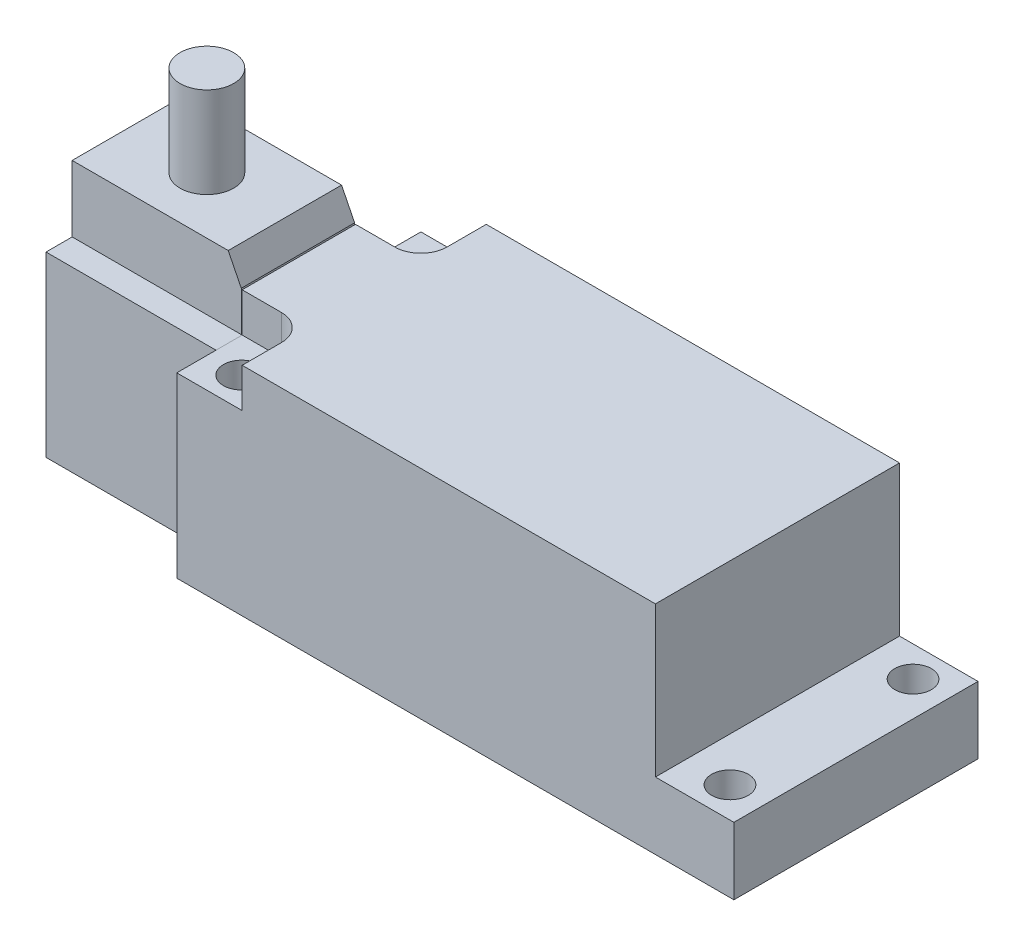
ISO-10303-21;
HEADER;
FILE_DESCRIPTION(('STEP AP214'),'2;1');
FILE_NAME('part.step','',(''),(''),'','','');
FILE_SCHEMA(('AUTOMOTIVE_DESIGN { 1 0 10303 214 1 1 1 1 }'));
ENDSEC;
DATA;
#1=APPLICATION_CONTEXT('core data for automotive mechanical design processes');
#2=APPLICATION_PROTOCOL_DEFINITION('international standard','automotive_design',2000,#1);
#3=PRODUCT_CONTEXT('',#1,'mechanical');
#4=PRODUCT('Part','Part','',(#3));
#5=PRODUCT_RELATED_PRODUCT_CATEGORY('part','',(#4));
#6=PRODUCT_DEFINITION_FORMATION('','',#4);
#7=PRODUCT_DEFINITION_CONTEXT('part definition',#1,'design');
#8=PRODUCT_DEFINITION('design','',#6,#7);
#9=PRODUCT_DEFINITION_SHAPE('','',#8);
#10=(LENGTH_UNIT() NAMED_UNIT(*) SI_UNIT(.MILLI.,.METRE.));
#11=(NAMED_UNIT(*) PLANE_ANGLE_UNIT() SI_UNIT($,.RADIAN.));
#12=(NAMED_UNIT(*) SI_UNIT($,.STERADIAN.) SOLID_ANGLE_UNIT());
#13=UNCERTAINTY_MEASURE_WITH_UNIT(LENGTH_MEASURE(1.E-05),#10,'distance_accuracy_value','');
#14=(GEOMETRIC_REPRESENTATION_CONTEXT(3) GLOBAL_UNCERTAINTY_ASSIGNED_CONTEXT((#13)) GLOBAL_UNIT_ASSIGNED_CONTEXT((#10,
#11,#12)) REPRESENTATION_CONTEXT('',''));
#15=CARTESIAN_POINT('',(0.,0.,0.));
#16=DIRECTION('',(0.,0.,1.));
#17=DIRECTION('',(1.,0.,0.));
#18=AXIS2_PLACEMENT_3D('',#15,#16,#17);
#19=CARTESIAN_POINT('',(0.,28.,0.));
#20=DIRECTION('',(0.,1.,0.));
#21=DIRECTION('',(0.,0.,1.));
#22=AXIS2_PLACEMENT_3D('',#19,#20,#21);
#23=PLANE('',#22);
#24=DIRECTION('',(-1.,0.,0.));
#25=VECTOR('',#24,1.);
#26=CARTESIAN_POINT('',(0.,28.,6.5));
#27=LINE('',#26,#25);
#28=CARTESIAN_POINT('',(-1.6,28.,6.5));
#29=VERTEX_POINT('',#28);
#30=CARTESIAN_POINT('',(-19.5,28.,6.5));
#31=VERTEX_POINT('',#30);
#32=EDGE_CURVE('E145',#29,#31,#27,.T.);
#33=ORIENTED_EDGE('',*,*,#32,.F.);
#34=DIRECTION('',(0.,0.,-1.));
#35=VECTOR('',#34,1.);
#36=CARTESIAN_POINT('',(-1.6,28.,0.));
#37=LINE('',#36,#35);
#38=CARTESIAN_POINT('',(-1.6,28.,-6.50000000000001));
#39=VERTEX_POINT('',#38);
#40=EDGE_CURVE('E63',#29,#39,#37,.T.);
#41=ORIENTED_EDGE('',*,*,#40,.T.);
#42=DIRECTION('',(1.,0.,0.));
#43=VECTOR('',#42,1.);
#44=CARTESIAN_POINT('',(0.,28.,-6.50000000000001));
#45=LINE('',#44,#43);
#46=CARTESIAN_POINT('',(-19.5,28.,-6.50000000000001));
#47=VERTEX_POINT('',#46);
#48=EDGE_CURVE('E126',#47,#39,#45,.T.);
#49=ORIENTED_EDGE('',*,*,#48,.F.);
#50=DIRECTION('',(0.,0.,-1.));
#51=VECTOR('',#50,1.);
#52=CARTESIAN_POINT('',(-19.5,28.,0.));
#53=LINE('',#52,#51);
#54=EDGE_CURVE('E138',#31,#47,#53,.T.);
#55=ORIENTED_EDGE('',*,*,#54,.F.);
#56=EDGE_LOOP('',(#33,#41,#49,#55));
#57=FACE_BOUND('',#56,.T.);
#58=CARTESIAN_POINT('',(-10.55,28.,0.));
#59=DIRECTION('',(0.,1.,0.));
#60=DIRECTION('',(0.,0.,1.));
#61=AXIS2_PLACEMENT_3D('',#58,#59,#60);
#62=CIRCLE('',#61,3.075);
#63=CARTESIAN_POINT('',(-10.55,28.,3.075));
#64=VERTEX_POINT('',#63);
#65=EDGE_CURVE('E366',#64,#64,#62,.T.);
#66=ORIENTED_EDGE('',*,*,#65,.F.);
#67=EDGE_LOOP('',(#66));
#68=FACE_BOUND('',#67,.T.);
#69=ADVANCED_FACE('F55',(#57,#68),#23,.T.);
#70=CARTESIAN_POINT('',(0.,20.4,9.5));
#71=DIRECTION('',(1.,0.,0.));
#72=DIRECTION('',(0.,0.,-1.));
#73=AXIS2_PLACEMENT_3D('',#70,#71,#72);
#74=PLANE('',#73);
#75=DIRECTION('',(0.,0.,1.));
#76=VECTOR('',#75,1.);
#77=CARTESIAN_POINT('',(0.,0.,9.5));
#78=LINE('',#77,#76);
#79=CARTESIAN_POINT('',(0.,0.,-9.5));
#80=VERTEX_POINT('',#79);
#81=CARTESIAN_POINT('',(0.,0.,9.5));
#82=VERTEX_POINT('',#81);
#83=EDGE_CURVE('E198',#80,#82,#78,.T.);
#84=ORIENTED_EDGE('',*,*,#83,.F.);
#85=DIRECTION('',(0.,-1.,0.));
#86=VECTOR('',#85,1.);
#87=CARTESIAN_POINT('',(0.,20.4,-9.5));
#88=LINE('',#87,#86);
#89=CARTESIAN_POINT('',(0.,20.4,-9.5));
#90=VERTEX_POINT('',#89);
#91=EDGE_CURVE('E167',#90,#80,#88,.T.);
#92=ORIENTED_EDGE('',*,*,#91,.F.);
#93=DIRECTION('',(0.,0.,1.));
#94=VECTOR('',#93,1.);
#95=CARTESIAN_POINT('',(0.,20.4,9.5));
#96=LINE('',#95,#94);
#97=CARTESIAN_POINT('',(0.,20.4,9.5));
#98=VERTEX_POINT('',#97);
#99=EDGE_CURVE('E207',#90,#98,#96,.T.);
#100=ORIENTED_EDGE('',*,*,#99,.T.);
#101=DIRECTION('',(0.,-1.,0.));
#102=VECTOR('',#101,1.);
#103=CARTESIAN_POINT('',(0.,20.4,9.5));
#104=LINE('',#103,#102);
#105=EDGE_CURVE('E184',#98,#82,#104,.T.);
#106=ORIENTED_EDGE('',*,*,#105,.T.);
#107=EDGE_LOOP('',(#84,#92,#100,#106));
#108=FACE_BOUND('',#107,.T.);
#109=ADVANCED_FACE('F232',(#108),#74,.T.);
#110=CARTESIAN_POINT('',(-19.5,20.4,-9.5));
#111=DIRECTION('',(0.,0.,-1.));
#112=DIRECTION('',(-1.,0.,0.));
#113=AXIS2_PLACEMENT_3D('',#110,#111,#112);
#114=PLANE('',#113);
#115=DIRECTION('',(1.,0.,0.));
#116=VECTOR('',#115,1.);
#117=CARTESIAN_POINT('',(-19.5,0.,-9.5));
#118=LINE('',#117,#116);
#119=CARTESIAN_POINT('',(-19.5,0.,-9.5));
#120=VERTEX_POINT('',#119);
#121=EDGE_CURVE('E180',#120,#80,#118,.T.);
#122=ORIENTED_EDGE('',*,*,#121,.F.);
#123=DIRECTION('',(0.,-1.,0.));
#124=VECTOR('',#123,1.);
#125=CARTESIAN_POINT('',(-19.5,20.4,-9.5));
#126=LINE('',#125,#124);
#127=CARTESIAN_POINT('',(-19.5,20.4,-9.5));
#128=VERTEX_POINT('',#127);
#129=EDGE_CURVE('E171',#128,#120,#126,.T.);
#130=ORIENTED_EDGE('',*,*,#129,.F.);
#131=DIRECTION('',(1.,0.,0.));
#132=VECTOR('',#131,1.);
#133=CARTESIAN_POINT('',(-19.5,20.4,-9.5));
#134=LINE('',#133,#132);
#135=EDGE_CURVE('E186',#128,#90,#134,.T.);
#136=ORIENTED_EDGE('',*,*,#135,.T.);
#137=ORIENTED_EDGE('',*,*,#91,.T.);
#138=EDGE_LOOP('',(#122,#130,#136,#137));
#139=FACE_BOUND('',#138,.T.);
#140=ADVANCED_FACE('F230',(#139),#114,.T.);
#141=CARTESIAN_POINT('',(-19.5,20.4,9.5));
#142=DIRECTION('',(-1.,0.,0.));
#143=DIRECTION('',(0.,0.,1.));
#144=AXIS2_PLACEMENT_3D('',#141,#142,#143);
#145=PLANE('',#144);
#146=DIRECTION('',(0.,0.,-1.));
#147=VECTOR('',#146,1.);
#148=CARTESIAN_POINT('',(-19.5,0.,9.5));
#149=LINE('',#148,#147);
#150=CARTESIAN_POINT('',(-19.5,0.,9.5));
#151=VERTEX_POINT('',#150);
#152=EDGE_CURVE('E203',#151,#120,#149,.T.);
#153=ORIENTED_EDGE('',*,*,#152,.F.);
#154=DIRECTION('',(0.,-1.,0.));
#155=VECTOR('',#154,1.);
#156=CARTESIAN_POINT('',(-19.5,20.4,9.5));
#157=LINE('',#156,#155);
#158=CARTESIAN_POINT('',(-19.5,20.4,9.5));
#159=VERTEX_POINT('',#158);
#160=EDGE_CURVE('E177',#159,#151,#157,.T.);
#161=ORIENTED_EDGE('',*,*,#160,.F.);
#162=DIRECTION('',(0.,0.,-1.));
#163=VECTOR('',#162,1.);
#164=CARTESIAN_POINT('',(-19.5,20.4,9.5));
#165=LINE('',#164,#163);
#166=CARTESIAN_POINT('',(-19.5,20.4,6.5));
#167=VERTEX_POINT('',#166);
#168=EDGE_CURVE('E187',#159,#167,#165,.T.);
#169=ORIENTED_EDGE('',*,*,#168,.T.);
#170=DIRECTION('',(0.,-1.,0.));
#171=VECTOR('',#170,1.);
#172=CARTESIAN_POINT('',(-19.5,28.,6.5));
#173=LINE('',#172,#171);
#174=EDGE_CURVE('E134',#31,#167,#173,.T.);
#175=ORIENTED_EDGE('',*,*,#174,.F.);
#176=ORIENTED_EDGE('',*,*,#54,.T.);
#177=DIRECTION('',(0.,-1.,0.));
#178=VECTOR('',#177,1.);
#179=CARTESIAN_POINT('',(-19.5,28.,-6.50000000000001));
#180=LINE('',#179,#178);
#181=CARTESIAN_POINT('',(-19.5,20.4,-6.50000000000001));
#182=VERTEX_POINT('',#181);
#183=EDGE_CURVE('E124',#47,#182,#180,.T.);
#184=ORIENTED_EDGE('',*,*,#183,.T.);
#185=EDGE_CURVE('E190',#182,#128,#165,.T.);
#186=ORIENTED_EDGE('',*,*,#185,.T.);
#187=ORIENTED_EDGE('',*,*,#129,.T.);
#188=EDGE_LOOP('',(#153,#161,#169,#175,#176,#184,#186,#187));
#189=FACE_BOUND('',#188,.T.);
#190=ADVANCED_FACE('F143',(#189),#145,.T.);
#191=CARTESIAN_POINT('',(-19.5,20.4,9.5));
#192=DIRECTION('',(0.,0.,1.));
#193=DIRECTION('',(1.,0.,0.));
#194=AXIS2_PLACEMENT_3D('',#191,#192,#193);
#195=PLANE('',#194);
#196=DIRECTION('',(-1.,0.,0.));
#197=VECTOR('',#196,1.);
#198=CARTESIAN_POINT('',(-19.5,0.,9.5));
#199=LINE('',#198,#197);
#200=EDGE_CURVE('E201',#82,#151,#199,.T.);
#201=ORIENTED_EDGE('',*,*,#200,.F.);
#202=ORIENTED_EDGE('',*,*,#105,.F.);
#203=DIRECTION('',(-1.,0.,0.));
#204=VECTOR('',#203,1.);
#205=CARTESIAN_POINT('',(-19.5,20.4,9.5));
#206=LINE('',#205,#204);
#207=EDGE_CURVE('E194',#98,#159,#206,.T.);
#208=ORIENTED_EDGE('',*,*,#207,.T.);
#209=ORIENTED_EDGE('',*,*,#160,.T.);
#210=EDGE_LOOP('',(#201,#202,#208,#209));
#211=FACE_BOUND('',#210,.T.);
#212=ADVANCED_FACE('F228',(#211),#195,.T.);
#213=CARTESIAN_POINT('',(0.,20.4,-9.5));
#214=DIRECTION('',(0.,-1.,0.));
#215=DIRECTION('',(0.,0.,-1.));
#216=AXIS2_PLACEMENT_3D('',#213,#214,#215);
#217=PLANE('',#216);
#218=DIRECTION('',(0.,0.,1.));
#219=VECTOR('',#218,1.);
#220=CARTESIAN_POINT('',(-0.100000000000001,20.4,0.));
#221=LINE('',#220,#219);
#222=CARTESIAN_POINT('',(-0.100000000000001,20.4,-6.50000000000001));
#223=VERTEX_POINT('',#222);
#224=CARTESIAN_POINT('',(-0.100000000000001,20.4,6.5));
#225=VERTEX_POINT('',#224);
#226=EDGE_CURVE('E151',#223,#225,#221,.T.);
#227=ORIENTED_EDGE('',*,*,#226,.T.);
#228=DIRECTION('',(-1.,0.,0.));
#229=VECTOR('',#228,1.);
#230=CARTESIAN_POINT('',(0.,20.4,6.5));
#231=LINE('',#230,#229);
#232=EDGE_CURVE('E139',#225,#167,#231,.T.);
#233=ORIENTED_EDGE('',*,*,#232,.T.);
#234=ORIENTED_EDGE('',*,*,#168,.F.);
#235=ORIENTED_EDGE('',*,*,#207,.F.);
#236=ORIENTED_EDGE('',*,*,#99,.F.);
#237=ORIENTED_EDGE('',*,*,#135,.F.);
#238=ORIENTED_EDGE('',*,*,#185,.F.);
#239=DIRECTION('',(1.,0.,0.));
#240=VECTOR('',#239,1.);
#241=CARTESIAN_POINT('',(0.,20.4,-6.50000000000001));
#242=LINE('',#241,#240);
#243=EDGE_CURVE('E129',#182,#223,#242,.T.);
#244=ORIENTED_EDGE('',*,*,#243,.T.);
#245=EDGE_LOOP('',(#227,#233,#234,#235,#236,#237,#238,#244));
#246=FACE_BOUND('',#245,.T.);
#247=ADVANCED_FACE('F216',(#246),#217,.F.);
#248=CARTESIAN_POINT('',(0.,0.,-9.5));
#249=DIRECTION('',(0.,-1.,0.));
#250=DIRECTION('',(0.,0.,-1.));
#251=AXIS2_PLACEMENT_3D('',#248,#249,#250);
#252=PLANE('',#251);
#253=ORIENTED_EDGE('',*,*,#83,.T.);
#254=ORIENTED_EDGE('',*,*,#200,.T.);
#255=ORIENTED_EDGE('',*,*,#152,.T.);
#256=ORIENTED_EDGE('',*,*,#121,.T.);
#257=EDGE_LOOP('',(#253,#254,#255,#256));
#258=FACE_BOUND('',#257,.T.);
#259=ADVANCED_FACE('F254',(#258),#252,.T.);
#260=CARTESIAN_POINT('',(-0.100000000000001,28.,0.));
#261=DIRECTION('',(1.,0.,0.));
#262=DIRECTION('',(0.,0.,-1.));
#263=AXIS2_PLACEMENT_3D('',#260,#261,#262);
#264=PLANE('',#263);
#265=DIRECTION('',(0.,-1.,0.));
#266=VECTOR('',#265,1.);
#267=CARTESIAN_POINT('',(-0.100000000000001,28.,-6.50000000000001));
#268=LINE('',#267,#266);
#269=CARTESIAN_POINT('',(-0.100000000000001,25.,-6.50000000000001));
#270=VERTEX_POINT('',#269);
#271=EDGE_CURVE('E133',#270,#223,#268,.T.);
#272=ORIENTED_EDGE('',*,*,#271,.F.);
#273=DIRECTION('',(0.,0.,1.));
#274=VECTOR('',#273,1.);
#275=CARTESIAN_POINT('',(-0.100000000000001,25.,0.));
#276=LINE('',#275,#274);
#277=CARTESIAN_POINT('',(-0.100000000000001,25.,6.5));
#278=VERTEX_POINT('',#277);
#279=EDGE_CURVE('E164',#270,#278,#276,.T.);
#280=ORIENTED_EDGE('',*,*,#279,.T.);
#281=DIRECTION('',(0.,-1.,0.));
#282=VECTOR('',#281,1.);
#283=CARTESIAN_POINT('',(-0.100000000000001,28.,6.5));
#284=LINE('',#283,#282);
#285=EDGE_CURVE('E147',#278,#225,#284,.T.);
#286=ORIENTED_EDGE('',*,*,#285,.T.);
#287=ORIENTED_EDGE('',*,*,#226,.F.);
#288=EDGE_LOOP('',(#272,#280,#286,#287));
#289=FACE_BOUND('',#288,.T.);
#290=ADVANCED_FACE('F213',(#289),#264,.T.);
#291=CARTESIAN_POINT('',(0.,28.,-6.50000000000001));
#292=DIRECTION('',(0.,0.,-1.));
#293=DIRECTION('',(-1.,0.,0.));
#294=AXIS2_PLACEMENT_3D('',#291,#292,#293);
#295=PLANE('',#294);
#296=ORIENTED_EDGE('',*,*,#48,.T.);
#297=DIRECTION('',(-0.447213595499956,0.894427190999917,0.));
#298=VECTOR('',#297,1.);
#299=CARTESIAN_POINT('',(-1.28000000000001,27.36,-6.50000000000001));
#300=LINE('',#299,#298);
#301=EDGE_CURVE('E12',#39,#270,#300,.F.);
#302=ORIENTED_EDGE('',*,*,#301,.T.);
#303=ORIENTED_EDGE('',*,*,#271,.T.);
#304=ORIENTED_EDGE('',*,*,#243,.F.);
#305=ORIENTED_EDGE('',*,*,#183,.F.);
#306=EDGE_LOOP('',(#296,#302,#303,#304,#305));
#307=FACE_BOUND('',#306,.T.);
#308=ADVANCED_FACE('F125',(#307),#295,.T.);
#309=CARTESIAN_POINT('',(0.,28.,6.5));
#310=DIRECTION('',(0.,0.,1.));
#311=DIRECTION('',(1.,0.,0.));
#312=AXIS2_PLACEMENT_3D('',#309,#310,#311);
#313=PLANE('',#312);
#314=ORIENTED_EDGE('',*,*,#285,.F.);
#315=DIRECTION('',(0.447213595499956,-0.894427190999917,0.));
#316=VECTOR('',#315,1.);
#317=CARTESIAN_POINT('',(-1.28000000000001,27.36,6.5));
#318=LINE('',#317,#316);
#319=EDGE_CURVE('E77',#278,#29,#318,.F.);
#320=ORIENTED_EDGE('',*,*,#319,.T.);
#321=ORIENTED_EDGE('',*,*,#32,.T.);
#322=ORIENTED_EDGE('',*,*,#174,.T.);
#323=ORIENTED_EDGE('',*,*,#232,.F.);
#324=EDGE_LOOP('',(#314,#320,#321,#322,#323));
#325=FACE_BOUND('',#324,.T.);
#326=ADVANCED_FACE('F223',(#325),#313,.T.);
#327=CARTESIAN_POINT('',(-0.100000000000001,25.,0.));
#328=DIRECTION('',(-0.894427190999917,-0.447213595499956,0.));
#329=DIRECTION('',(0.447213595499956,-0.894427190999917,0.));
#330=AXIS2_PLACEMENT_3D('',#327,#328,#329);
#331=PLANE('',#330);
#332=ORIENTED_EDGE('',*,*,#301,.F.);
#333=ORIENTED_EDGE('',*,*,#40,.F.);
#334=ORIENTED_EDGE('',*,*,#319,.F.);
#335=ORIENTED_EDGE('',*,*,#279,.F.);
#336=EDGE_LOOP('',(#332,#333,#334,#335));
#337=FACE_BOUND('',#336,.T.);
#338=ADVANCED_FACE('F57',(#337),#331,.F.);
#339=CARTESIAN_POINT('',(-10.55,38.4,0.));
#340=DIRECTION('',(0.,-1.,0.));
#341=DIRECTION('',(0.,0.,-1.));
#342=AXIS2_PLACEMENT_3D('',#339,#340,#341);
#343=CYLINDRICAL_SURFACE('',#342,3.075);
#344=CARTESIAN_POINT('',(-10.55,38.4,0.));
#345=DIRECTION('',(0.,1.,0.));
#346=DIRECTION('',(0.,0.,1.));
#347=AXIS2_PLACEMENT_3D('',#344,#345,#346);
#348=CIRCLE('',#347,3.075);
#349=CARTESIAN_POINT('',(-10.55,38.4,3.075));
#350=VERTEX_POINT('',#349);
#351=EDGE_CURVE('E154',#350,#350,#348,.T.);
#352=ORIENTED_EDGE('',*,*,#351,.F.);
#353=EDGE_LOOP('',(#352));
#354=FACE_BOUND('',#353,.T.);
#355=ORIENTED_EDGE('',*,*,#65,.T.);
#356=EDGE_LOOP('',(#355));
#357=FACE_BOUND('',#356,.T.);
#358=ADVANCED_FACE('F246',(#354,#357),#343,.T.);
#359=CARTESIAN_POINT('',(-10.55,38.4,0.));
#360=DIRECTION('',(0.,1.,0.));
#361=DIRECTION('',(0.,0.,1.));
#362=AXIS2_PLACEMENT_3D('',#359,#360,#361);
#363=PLANE('',#362);
#364=ORIENTED_EDGE('',*,*,#351,.T.);
#365=EDGE_LOOP('',(#364));
#366=FACE_BOUND('',#365,.T.);
#367=ADVANCED_FACE('F356',(#366),#363,.T.);
#368=CLOSED_SHELL('',(#69,#109,#140,#190,#212,#247,#259,#290,#308,#326,#338,#358,#367));
#369=MANIFOLD_SOLID_BREP('B2',#368);
#370=CARTESIAN_POINT('',(63.9,24.9,14.));
#371=DIRECTION('',(-1.,0.,0.));
#372=DIRECTION('',(0.,0.,1.));
#373=AXIS2_PLACEMENT_3D('',#370,#371,#372);
#374=PLANE('',#373);
#375=DIRECTION('',(0.,-1.,0.));
#376=VECTOR('',#375,1.);
#377=CARTESIAN_POINT('',(63.9,24.9,-14.));
#378=LINE('',#377,#376);
#379=CARTESIAN_POINT('',(63.9,7.7,-14.));
#380=VERTEX_POINT('',#379);
#381=CARTESIAN_POINT('',(63.9,0.,-14.));
#382=VERTEX_POINT('',#381);
#383=EDGE_CURVE('E53',#380,#382,#378,.T.);
#384=ORIENTED_EDGE('',*,*,#383,.F.);
#385=DIRECTION('',(0.,0.,1.));
#386=VECTOR('',#385,1.);
#387=CARTESIAN_POINT('',(63.9,7.7,-14.));
#388=LINE('',#387,#386);
#389=CARTESIAN_POINT('',(63.9,7.7,14.));
#390=VERTEX_POINT('',#389);
#391=EDGE_CURVE('E566',#380,#390,#388,.T.);
#392=ORIENTED_EDGE('',*,*,#391,.T.);
#393=DIRECTION('',(0.,-1.,0.));
#394=VECTOR('',#393,1.);
#395=CARTESIAN_POINT('',(63.9,24.9,14.));
#396=LINE('',#395,#394);
#397=CARTESIAN_POINT('',(63.9,0.,14.));
#398=VERTEX_POINT('',#397);
#399=EDGE_CURVE('E582',#390,#398,#396,.T.);
#400=ORIENTED_EDGE('',*,*,#399,.T.);
#401=DIRECTION('',(0.,0.,-1.));
#402=VECTOR('',#401,1.);
#403=CARTESIAN_POINT('',(63.9,0.,14.));
#404=LINE('',#403,#402);
#405=EDGE_CURVE('E569',#398,#382,#404,.T.);
#406=ORIENTED_EDGE('',*,*,#405,.T.);
#407=EDGE_LOOP('',(#384,#392,#400,#406));
#408=FACE_BOUND('',#407,.T.);
#409=ADVANCED_FACE('F384',(#408),#374,.F.);
#410=CARTESIAN_POINT('',(0.,24.9,-14.));
#411=DIRECTION('',(0.,0.,1.));
#412=DIRECTION('',(1.,0.,0.));
#413=AXIS2_PLACEMENT_3D('',#410,#411,#412);
#414=PLANE('',#413);
#415=DIRECTION('',(-1.,0.,0.));
#416=VECTOR('',#415,1.);
#417=CARTESIAN_POINT('',(0.,20.4,-14.));
#418=LINE('',#417,#416);
#419=CARTESIAN_POINT('',(7.5,20.4,-14.));
#420=VERTEX_POINT('',#419);
#421=CARTESIAN_POINT('',(0.,20.4,-14.));
#422=VERTEX_POINT('',#421);
#423=EDGE_CURVE('E500',#420,#422,#418,.T.);
#424=ORIENTED_EDGE('',*,*,#423,.F.);
#425=DIRECTION('',(0.,1.,0.));
#426=VECTOR('',#425,1.);
#427=CARTESIAN_POINT('',(7.5,20.4,-14.));
#428=LINE('',#427,#426);
#429=CARTESIAN_POINT('',(7.5,24.9,-14.));
#430=VERTEX_POINT('',#429);
#431=EDGE_CURVE('E491',#420,#430,#428,.T.);
#432=ORIENTED_EDGE('',*,*,#431,.T.);
#433=DIRECTION('',(-1.,0.,0.));
#434=VECTOR('',#433,1.);
#435=CARTESIAN_POINT('',(0.,24.9,-14.));
#436=LINE('',#435,#434);
#437=CARTESIAN_POINT('',(54.9,24.9,-14.));
#438=VERTEX_POINT('',#437);
#439=EDGE_CURVE('E574',#438,#430,#436,.T.);
#440=ORIENTED_EDGE('',*,*,#439,.F.);
#441=DIRECTION('',(0.,-1.,0.));
#442=VECTOR('',#441,1.);
#443=CARTESIAN_POINT('',(54.9,24.9,-14.));
#444=LINE('',#443,#442);
#445=CARTESIAN_POINT('',(54.9,7.7,-14.));
#446=VERTEX_POINT('',#445);
#447=EDGE_CURVE('E555',#438,#446,#444,.T.);
#448=ORIENTED_EDGE('',*,*,#447,.T.);
#449=DIRECTION('',(1.,0.,0.));
#450=VECTOR('',#449,1.);
#451=CARTESIAN_POINT('',(63.9,7.7,-14.));
#452=LINE('',#451,#450);
#453=EDGE_CURVE('E558',#446,#380,#452,.T.);
#454=ORIENTED_EDGE('',*,*,#453,.T.);
#455=ORIENTED_EDGE('',*,*,#383,.T.);
#456=DIRECTION('',(-1.,0.,0.));
#457=VECTOR('',#456,1.);
#458=CARTESIAN_POINT('',(0.,0.,-14.));
#459=LINE('',#458,#457);
#460=CARTESIAN_POINT('',(0.,0.,-14.));
#461=VERTEX_POINT('',#460);
#462=EDGE_CURVE('E585',#382,#461,#459,.T.);
#463=ORIENTED_EDGE('',*,*,#462,.T.);
#464=DIRECTION('',(0.,-1.,0.));
#465=VECTOR('',#464,1.);
#466=CARTESIAN_POINT('',(0.,24.9,-14.));
#467=LINE('',#466,#465);
#468=EDGE_CURVE('E392',#422,#461,#467,.T.);
#469=ORIENTED_EDGE('',*,*,#468,.F.);
#470=EDGE_LOOP('',(#424,#432,#440,#448,#454,#455,#463,#469));
#471=FACE_BOUND('',#470,.T.);
#472=ADVANCED_FACE('F607',(#471),#414,.F.);
#473=CARTESIAN_POINT('',(0.,24.9,14.));
#474=DIRECTION('',(1.,0.,0.));
#475=DIRECTION('',(0.,0.,-1.));
#476=AXIS2_PLACEMENT_3D('',#473,#474,#475);
#477=PLANE('',#476);
#478=DIRECTION('',(0.,0.,1.));
#479=VECTOR('',#478,1.);
#480=CARTESIAN_POINT('',(0.,24.9,14.));
#481=LINE('',#480,#479);
#482=CARTESIAN_POINT('',(0.,24.9,-6.50000000000001));
#483=VERTEX_POINT('',#482);
#484=CARTESIAN_POINT('',(0.,24.9,6.5));
#485=VERTEX_POINT('',#484);
#486=EDGE_CURVE('E577',#483,#485,#481,.T.);
#487=ORIENTED_EDGE('',*,*,#486,.F.);
#488=DIRECTION('',(0.,1.,0.));
#489=VECTOR('',#488,1.);
#490=CARTESIAN_POINT('',(0.,20.4,-6.50000000000001));
#491=LINE('',#490,#489);
#492=CARTESIAN_POINT('',(0.,20.4,-6.50000000000001));
#493=VERTEX_POINT('',#492);
#494=EDGE_CURVE('E522',#493,#483,#491,.T.);
#495=ORIENTED_EDGE('',*,*,#494,.F.);
#496=DIRECTION('',(0.,0.,1.));
#497=VECTOR('',#496,1.);
#498=CARTESIAN_POINT('',(0.,20.4,-14.));
#499=LINE('',#498,#497);
#500=EDGE_CURVE('E514',#422,#493,#499,.T.);
#501=ORIENTED_EDGE('',*,*,#500,.F.);
#502=ORIENTED_EDGE('',*,*,#468,.T.);
#503=DIRECTION('',(0.,0.,1.));
#504=VECTOR('',#503,1.);
#505=CARTESIAN_POINT('',(0.,0.,14.));
#506=LINE('',#505,#504);
#507=CARTESIAN_POINT('',(0.,0.,14.));
#508=VERTEX_POINT('',#507);
#509=EDGE_CURVE('E588',#461,#508,#506,.T.);
#510=ORIENTED_EDGE('',*,*,#509,.T.);
#511=DIRECTION('',(0.,-1.,0.));
#512=VECTOR('',#511,1.);
#513=CARTESIAN_POINT('',(0.,24.9,14.));
#514=LINE('',#513,#512);
#515=CARTESIAN_POINT('',(0.,20.4,14.));
#516=VERTEX_POINT('',#515);
#517=EDGE_CURVE('E594',#516,#508,#514,.T.);
#518=ORIENTED_EDGE('',*,*,#517,.F.);
#519=DIRECTION('',(0.,0.,1.));
#520=VECTOR('',#519,1.);
#521=CARTESIAN_POINT('',(0.,20.4,14.));
#522=LINE('',#521,#520);
#523=CARTESIAN_POINT('',(0.,20.4,6.5));
#524=VERTEX_POINT('',#523);
#525=EDGE_CURVE('E525',#524,#516,#522,.T.);
#526=ORIENTED_EDGE('',*,*,#525,.F.);
#527=DIRECTION('',(0.,1.,0.));
#528=VECTOR('',#527,1.);
#529=CARTESIAN_POINT('',(0.,20.4,6.5));
#530=LINE('',#529,#528);
#531=EDGE_CURVE('E546',#524,#485,#530,.T.);
#532=ORIENTED_EDGE('',*,*,#531,.T.);
#533=EDGE_LOOP('',(#487,#495,#501,#502,#510,#518,#526,#532));
#534=FACE_BOUND('',#533,.T.);
#535=ADVANCED_FACE('F600',(#534),#477,.F.);
#536=CARTESIAN_POINT('',(0.,24.9,14.));
#537=DIRECTION('',(0.,0.,-1.));
#538=DIRECTION('',(-1.,0.,0.));
#539=AXIS2_PLACEMENT_3D('',#536,#537,#538);
#540=PLANE('',#539);
#541=DIRECTION('',(1.,0.,0.));
#542=VECTOR('',#541,1.);
#543=CARTESIAN_POINT('',(0.,24.9,14.));
#544=LINE('',#543,#542);
#545=CARTESIAN_POINT('',(7.5,24.9,14.));
#546=VERTEX_POINT('',#545);
#547=CARTESIAN_POINT('',(54.9,24.9,14.));
#548=VERTEX_POINT('',#547);
#549=EDGE_CURVE('E580',#546,#548,#544,.T.);
#550=ORIENTED_EDGE('',*,*,#549,.F.);
#551=DIRECTION('',(0.,1.,0.));
#552=VECTOR('',#551,1.);
#553=CARTESIAN_POINT('',(7.5,20.4,14.));
#554=LINE('',#553,#552);
#555=CARTESIAN_POINT('',(7.5,20.4,14.));
#556=VERTEX_POINT('',#555);
#557=EDGE_CURVE('E407',#556,#546,#554,.T.);
#558=ORIENTED_EDGE('',*,*,#557,.F.);
#559=DIRECTION('',(1.,0.,0.));
#560=VECTOR('',#559,1.);
#561=CARTESIAN_POINT('',(0.,20.4,14.));
#562=LINE('',#561,#560);
#563=EDGE_CURVE('E527',#516,#556,#562,.T.);
#564=ORIENTED_EDGE('',*,*,#563,.F.);
#565=ORIENTED_EDGE('',*,*,#517,.T.);
#566=DIRECTION('',(1.,0.,0.));
#567=VECTOR('',#566,1.);
#568=CARTESIAN_POINT('',(0.,0.,14.));
#569=LINE('',#568,#567);
#570=EDGE_CURVE('E578',#508,#398,#569,.T.);
#571=ORIENTED_EDGE('',*,*,#570,.T.);
#572=ORIENTED_EDGE('',*,*,#399,.F.);
#573=DIRECTION('',(1.,0.,0.));
#574=VECTOR('',#573,1.);
#575=CARTESIAN_POINT('',(63.9,7.7,14.));
#576=LINE('',#575,#574);
#577=CARTESIAN_POINT('',(54.9,7.7,14.));
#578=VERTEX_POINT('',#577);
#579=EDGE_CURVE('E559',#578,#390,#576,.T.);
#580=ORIENTED_EDGE('',*,*,#579,.F.);
#581=DIRECTION('',(0.,-1.,0.));
#582=VECTOR('',#581,1.);
#583=CARTESIAN_POINT('',(54.9,24.9,14.));
#584=LINE('',#583,#582);
#585=EDGE_CURVE('E549',#548,#578,#584,.T.);
#586=ORIENTED_EDGE('',*,*,#585,.F.);
#587=EDGE_LOOP('',(#550,#558,#564,#565,#571,#572,#580,#586));
#588=FACE_BOUND('',#587,.T.);
#589=ADVANCED_FACE('F615',(#588),#540,.F.);
#590=CARTESIAN_POINT('',(63.9,24.9,-14.));
#591=DIRECTION('',(0.,-1.,0.));
#592=DIRECTION('',(0.,0.,-1.));
#593=AXIS2_PLACEMENT_3D('',#590,#591,#592);
#594=PLANE('',#593);
#595=CARTESIAN_POINT('',(4.5,24.9,-9.50000000000001));
#596=DIRECTION('',(0.,1.,0.));
#597=DIRECTION('',(0.,0.,1.));
#598=AXIS2_PLACEMENT_3D('',#595,#596,#597);
#599=CIRCLE('',#598,3.);
#600=CARTESIAN_POINT('',(4.5,24.9,-6.50000000000001));
#601=VERTEX_POINT('',#600);
#602=CARTESIAN_POINT('',(7.5,24.9,-9.50000000000001));
#603=VERTEX_POINT('',#602);
#604=EDGE_CURVE('E399',#601,#603,#599,.T.);
#605=ORIENTED_EDGE('',*,*,#604,.F.);
#606=DIRECTION('',(1.,0.,0.));
#607=VECTOR('',#606,1.);
#608=CARTESIAN_POINT('',(0.,24.9,-6.50000000000001));
#609=LINE('',#608,#607);
#610=EDGE_CURVE('E504',#483,#601,#609,.T.);
#611=ORIENTED_EDGE('',*,*,#610,.F.);
#612=ORIENTED_EDGE('',*,*,#486,.T.);
#613=DIRECTION('',(-1.,0.,0.));
#614=VECTOR('',#613,1.);
#615=CARTESIAN_POINT('',(0.,24.9,6.5));
#616=LINE('',#615,#614);
#617=CARTESIAN_POINT('',(4.5,24.9,6.5));
#618=VERTEX_POINT('',#617);
#619=EDGE_CURVE('E528',#618,#485,#616,.T.);
#620=ORIENTED_EDGE('',*,*,#619,.F.);
#621=CARTESIAN_POINT('',(4.5,24.9,9.5));
#622=DIRECTION('',(0.,1.,0.));
#623=DIRECTION('',(0.,0.,-1.));
#624=AXIS2_PLACEMENT_3D('',#621,#622,#623);
#625=CIRCLE('',#624,3.);
#626=CARTESIAN_POINT('',(7.5,24.9,9.5));
#627=VERTEX_POINT('',#626);
#628=EDGE_CURVE('E541',#627,#618,#625,.T.);
#629=ORIENTED_EDGE('',*,*,#628,.F.);
#630=DIRECTION('',(0.,0.,-1.));
#631=VECTOR('',#630,1.);
#632=CARTESIAN_POINT('',(7.5,24.9,14.));
#633=LINE('',#632,#631);
#634=EDGE_CURVE('E521',#546,#627,#633,.T.);
#635=ORIENTED_EDGE('',*,*,#634,.F.);
#636=ORIENTED_EDGE('',*,*,#549,.T.);
#637=DIRECTION('',(0.,0.,1.));
#638=VECTOR('',#637,1.);
#639=CARTESIAN_POINT('',(54.9,24.9,-14.));
#640=LINE('',#639,#638);
#641=EDGE_CURVE('E562',#438,#548,#640,.T.);
#642=ORIENTED_EDGE('',*,*,#641,.F.);
#643=ORIENTED_EDGE('',*,*,#439,.T.);
#644=DIRECTION('',(0.,0.,-1.));
#645=VECTOR('',#644,1.);
#646=CARTESIAN_POINT('',(7.5,24.9,-14.));
#647=LINE('',#646,#645);
#648=EDGE_CURVE('E507',#603,#430,#647,.T.);
#649=ORIENTED_EDGE('',*,*,#648,.F.);
#650=EDGE_LOOP('',(#605,#611,#612,#620,#629,#635,#636,#642,#643,#649));
#651=FACE_BOUND('',#650,.T.);
#652=ADVANCED_FACE('F628',(#651),#594,.F.);
#653=CARTESIAN_POINT('',(63.9,0.,-14.));
#654=DIRECTION('',(0.,-1.,0.));
#655=DIRECTION('',(0.,0.,-1.));
#656=AXIS2_PLACEMENT_3D('',#653,#654,#655);
#657=PLANE('',#656);
#658=CARTESIAN_POINT('',(3.95000000000001,0.,10.5));
#659=DIRECTION('',(0.,-1.,0.));
#660=DIRECTION('',(0.,0.,-1.));
#661=AXIS2_PLACEMENT_3D('',#658,#659,#660);
#662=CIRCLE('',#661,2.09999999999999);
#663=CARTESIAN_POINT('',(3.95000000000001,0.,8.40000000000001));
#664=VERTEX_POINT('',#663);
#665=EDGE_CURVE('E703',#664,#664,#662,.T.);
#666=ORIENTED_EDGE('',*,*,#665,.F.);
#667=EDGE_LOOP('',(#666));
#668=FACE_BOUND('',#667,.T.);
#669=CARTESIAN_POINT('',(3.95000000000001,0.,-10.5));
#670=DIRECTION('',(0.,-1.,0.));
#671=DIRECTION('',(0.,0.,-1.));
#672=AXIS2_PLACEMENT_3D('',#669,#670,#671);
#673=CIRCLE('',#672,2.09999999999999);
#674=CARTESIAN_POINT('',(3.95000000000001,0.,-12.6));
#675=VERTEX_POINT('',#674);
#676=EDGE_CURVE('E707',#675,#675,#673,.T.);
#677=ORIENTED_EDGE('',*,*,#676,.F.);
#678=EDGE_LOOP('',(#677));
#679=FACE_BOUND('',#678,.T.);
#680=CARTESIAN_POINT('',(59.95,0.,10.5));
#681=DIRECTION('',(0.,-1.,0.));
#682=DIRECTION('',(0.,0.,-1.));
#683=AXIS2_PLACEMENT_3D('',#680,#681,#682);
#684=CIRCLE('',#683,2.09999999999998);
#685=CARTESIAN_POINT('',(59.95,0.,8.40000000000002));
#686=VERTEX_POINT('',#685);
#687=EDGE_CURVE('E713',#686,#686,#684,.T.);
#688=ORIENTED_EDGE('',*,*,#687,.F.);
#689=EDGE_LOOP('',(#688));
#690=FACE_BOUND('',#689,.T.);
#691=CARTESIAN_POINT('',(59.95,0.,-10.5));
#692=DIRECTION('',(0.,-1.,0.));
#693=DIRECTION('',(0.,0.,-1.));
#694=AXIS2_PLACEMENT_3D('',#691,#692,#693);
#695=CIRCLE('',#694,2.09999999999998);
#696=CARTESIAN_POINT('',(59.95,0.,-12.6));
#697=VERTEX_POINT('',#696);
#698=EDGE_CURVE('E718',#697,#697,#695,.T.);
#699=ORIENTED_EDGE('',*,*,#698,.F.);
#700=EDGE_LOOP('',(#699));
#701=FACE_BOUND('',#700,.T.);
#702=ORIENTED_EDGE('',*,*,#405,.F.);
#703=ORIENTED_EDGE('',*,*,#570,.F.);
#704=ORIENTED_EDGE('',*,*,#509,.F.);
#705=ORIENTED_EDGE('',*,*,#462,.F.);
#706=EDGE_LOOP('',(#702,#703,#704,#705));
#707=FACE_BOUND('',#706,.T.);
#708=ADVANCED_FACE('F611',(#668,#679,#690,#701,#707),#657,.T.);
#709=CARTESIAN_POINT('',(63.9,7.7,-14.));
#710=DIRECTION('',(0.,-1.,0.));
#711=DIRECTION('',(1.,0.,0.));
#712=AXIS2_PLACEMENT_3D('',#709,#710,#711);
#713=PLANE('',#712);
#714=CARTESIAN_POINT('',(59.95,7.7,10.5));
#715=DIRECTION('',(0.,-1.,0.));
#716=DIRECTION('',(1.,0.,0.));
#717=AXIS2_PLACEMENT_3D('',#714,#715,#716);
#718=CIRCLE('',#717,2.09999999999998);
#719=CARTESIAN_POINT('',(62.05,7.7,10.5));
#720=VERTEX_POINT('',#719);
#721=EDGE_CURVE('E716',#720,#720,#718,.T.);
#722=ORIENTED_EDGE('',*,*,#721,.T.);
#723=EDGE_LOOP('',(#722));
#724=FACE_BOUND('',#723,.T.);
#725=CARTESIAN_POINT('',(59.95,7.7,-10.5));
#726=DIRECTION('',(0.,-1.,0.));
#727=DIRECTION('',(1.,0.,0.));
#728=AXIS2_PLACEMENT_3D('',#725,#726,#727);
#729=CIRCLE('',#728,2.09999999999998);
#730=CARTESIAN_POINT('',(62.05,7.7,-10.5));
#731=VERTEX_POINT('',#730);
#732=EDGE_CURVE('E510',#731,#731,#729,.T.);
#733=ORIENTED_EDGE('',*,*,#732,.T.);
#734=EDGE_LOOP('',(#733));
#735=FACE_BOUND('',#734,.T.);
#736=ORIENTED_EDGE('',*,*,#579,.T.);
#737=ORIENTED_EDGE('',*,*,#391,.F.);
#738=ORIENTED_EDGE('',*,*,#453,.F.);
#739=DIRECTION('',(0.,0.,1.));
#740=VECTOR('',#739,1.);
#741=CARTESIAN_POINT('',(54.9,7.7,-14.));
#742=LINE('',#741,#740);
#743=EDGE_CURVE('E570',#446,#578,#742,.T.);
#744=ORIENTED_EDGE('',*,*,#743,.T.);
#745=EDGE_LOOP('',(#736,#737,#738,#744));
#746=FACE_BOUND('',#745,.T.);
#747=ADVANCED_FACE('F639',(#724,#735,#746),#713,.F.);
#748=CARTESIAN_POINT('',(54.9,24.9,-14.));
#749=DIRECTION('',(-1.,0.,0.));
#750=DIRECTION('',(0.,0.,1.));
#751=AXIS2_PLACEMENT_3D('',#748,#749,#750);
#752=PLANE('',#751);
#753=ORIENTED_EDGE('',*,*,#585,.T.);
#754=ORIENTED_EDGE('',*,*,#743,.F.);
#755=ORIENTED_EDGE('',*,*,#447,.F.);
#756=ORIENTED_EDGE('',*,*,#641,.T.);
#757=EDGE_LOOP('',(#753,#754,#755,#756));
#758=FACE_BOUND('',#757,.T.);
#759=ADVANCED_FACE('F636',(#758),#752,.F.);
#760=CARTESIAN_POINT('',(0.,20.4,6.5));
#761=DIRECTION('',(0.,0.,-1.));
#762=DIRECTION('',(-1.,0.,0.));
#763=AXIS2_PLACEMENT_3D('',#760,#761,#762);
#764=PLANE('',#763);
#765=ORIENTED_EDGE('',*,*,#619,.T.);
#766=ORIENTED_EDGE('',*,*,#531,.F.);
#767=DIRECTION('',(-1.,0.,0.));
#768=VECTOR('',#767,1.);
#769=CARTESIAN_POINT('',(0.,20.4,6.5));
#770=LINE('',#769,#768);
#771=CARTESIAN_POINT('',(4.5,20.4,6.5));
#772=VERTEX_POINT('',#771);
#773=EDGE_CURVE('E537',#772,#524,#770,.T.);
#774=ORIENTED_EDGE('',*,*,#773,.F.);
#775=DIRECTION('',(0.,1.,0.));
#776=VECTOR('',#775,1.);
#777=CARTESIAN_POINT('',(4.5,20.4,6.5));
#778=LINE('',#777,#776);
#779=EDGE_CURVE('E550',#772,#618,#778,.T.);
#780=ORIENTED_EDGE('',*,*,#779,.T.);
#781=EDGE_LOOP('',(#765,#766,#774,#780));
#782=FACE_BOUND('',#781,.T.);
#783=ADVANCED_FACE('F624',(#782),#764,.F.);
#784=CARTESIAN_POINT('',(4.5,20.4,9.5));
#785=DIRECTION('',(0.,1.,0.));
#786=DIRECTION('',(0.,0.,1.));
#787=AXIS2_PLACEMENT_3D('',#784,#785,#786);
#788=CYLINDRICAL_SURFACE('',#787,3.);
#789=ORIENTED_EDGE('',*,*,#628,.T.);
#790=ORIENTED_EDGE('',*,*,#779,.F.);
#791=CARTESIAN_POINT('',(4.5,20.4,9.5));
#792=DIRECTION('',(0.,1.,0.));
#793=DIRECTION('',(0.,0.,-1.));
#794=AXIS2_PLACEMENT_3D('',#791,#792,#793);
#795=CIRCLE('',#794,3.);
#796=CARTESIAN_POINT('',(7.5,20.4,9.5));
#797=VERTEX_POINT('',#796);
#798=EDGE_CURVE('E534',#797,#772,#795,.T.);
#799=ORIENTED_EDGE('',*,*,#798,.F.);
#800=DIRECTION('',(0.,1.,0.));
#801=VECTOR('',#800,1.);
#802=CARTESIAN_POINT('',(7.5,20.4,9.5));
#803=LINE('',#802,#801);
#804=EDGE_CURVE('E552',#797,#627,#803,.T.);
#805=ORIENTED_EDGE('',*,*,#804,.T.);
#806=EDGE_LOOP('',(#789,#790,#799,#805));
#807=FACE_BOUND('',#806,.T.);
#808=ADVANCED_FACE('F665',(#807),#788,.F.);
#809=CARTESIAN_POINT('',(7.5,20.4,14.));
#810=DIRECTION('',(1.,0.,0.));
#811=DIRECTION('',(0.,0.,-1.));
#812=AXIS2_PLACEMENT_3D('',#809,#810,#811);
#813=PLANE('',#812);
#814=ORIENTED_EDGE('',*,*,#634,.T.);
#815=ORIENTED_EDGE('',*,*,#804,.F.);
#816=DIRECTION('',(0.,0.,-1.));
#817=VECTOR('',#816,1.);
#818=CARTESIAN_POINT('',(7.5,20.4,14.));
#819=LINE('',#818,#817);
#820=EDGE_CURVE('E531',#556,#797,#819,.T.);
#821=ORIENTED_EDGE('',*,*,#820,.F.);
#822=ORIENTED_EDGE('',*,*,#557,.T.);
#823=EDGE_LOOP('',(#814,#815,#821,#822));
#824=FACE_BOUND('',#823,.T.);
#825=ADVANCED_FACE('F662',(#824),#813,.F.);
#826=CARTESIAN_POINT('',(4.5,20.4,9.5));
#827=DIRECTION('',(0.,-1.,0.));
#828=DIRECTION('',(0.,0.,-1.));
#829=AXIS2_PLACEMENT_3D('',#826,#827,#828);
#830=PLANE('',#829);
#831=CARTESIAN_POINT('',(3.95000000000001,20.4,10.5));
#832=DIRECTION('',(0.,-1.,0.));
#833=DIRECTION('',(0.,0.,-1.));
#834=AXIS2_PLACEMENT_3D('',#831,#832,#833);
#835=CIRCLE('',#834,2.09999999999999);
#836=CARTESIAN_POINT('',(3.95000000000001,20.4,8.40000000000002));
#837=VERTEX_POINT('',#836);
#838=EDGE_CURVE('E706',#837,#837,#835,.T.);
#839=ORIENTED_EDGE('',*,*,#838,.T.);
#840=EDGE_LOOP('',(#839));
#841=FACE_BOUND('',#840,.T.);
#842=ORIENTED_EDGE('',*,*,#525,.T.);
#843=ORIENTED_EDGE('',*,*,#563,.T.);
#844=ORIENTED_EDGE('',*,*,#820,.T.);
#845=ORIENTED_EDGE('',*,*,#798,.T.);
#846=ORIENTED_EDGE('',*,*,#773,.T.);
#847=EDGE_LOOP('',(#842,#843,#844,#845,#846));
#848=FACE_BOUND('',#847,.T.);
#849=ADVANCED_FACE('F620',(#841,#848),#830,.F.);
#850=CARTESIAN_POINT('',(4.5,20.4,-9.50000000000001));
#851=DIRECTION('',(0.,1.,0.));
#852=DIRECTION('',(0.,0.,1.));
#853=AXIS2_PLACEMENT_3D('',#850,#851,#852);
#854=CYLINDRICAL_SURFACE('',#853,3.);
#855=ORIENTED_EDGE('',*,*,#604,.T.);
#856=DIRECTION('',(0.,1.,0.));
#857=VECTOR('',#856,1.);
#858=CARTESIAN_POINT('',(7.5,20.4,-9.50000000000001));
#859=LINE('',#858,#857);
#860=CARTESIAN_POINT('',(7.5,20.4,-9.50000000000001));
#861=VERTEX_POINT('',#860);
#862=EDGE_CURVE('E483',#861,#603,#859,.T.);
#863=ORIENTED_EDGE('',*,*,#862,.F.);
#864=CARTESIAN_POINT('',(4.5,20.4,-9.50000000000001));
#865=DIRECTION('',(0.,1.,0.));
#866=DIRECTION('',(0.,0.,1.));
#867=AXIS2_PLACEMENT_3D('',#864,#865,#866);
#868=CIRCLE('',#867,3.);
#869=CARTESIAN_POINT('',(4.5,20.4,-6.50000000000001));
#870=VERTEX_POINT('',#869);
#871=EDGE_CURVE('E487',#870,#861,#868,.T.);
#872=ORIENTED_EDGE('',*,*,#871,.F.);
#873=DIRECTION('',(0.,1.,0.));
#874=VECTOR('',#873,1.);
#875=CARTESIAN_POINT('',(4.5,20.4,-6.50000000000001));
#876=LINE('',#875,#874);
#877=EDGE_CURVE('E519',#870,#601,#876,.T.);
#878=ORIENTED_EDGE('',*,*,#877,.T.);
#879=EDGE_LOOP('',(#855,#863,#872,#878));
#880=FACE_BOUND('',#879,.T.);
#881=ADVANCED_FACE('F485',(#880),#854,.F.);
#882=CARTESIAN_POINT('',(0.,20.4,-6.50000000000001));
#883=DIRECTION('',(0.,0.,1.));
#884=DIRECTION('',(1.,0.,0.));
#885=AXIS2_PLACEMENT_3D('',#882,#883,#884);
#886=PLANE('',#885);
#887=ORIENTED_EDGE('',*,*,#610,.T.);
#888=ORIENTED_EDGE('',*,*,#877,.F.);
#889=DIRECTION('',(1.,0.,0.));
#890=VECTOR('',#889,1.);
#891=CARTESIAN_POINT('',(0.,20.4,-6.50000000000001));
#892=LINE('',#891,#890);
#893=EDGE_CURVE('E492',#493,#870,#892,.T.);
#894=ORIENTED_EDGE('',*,*,#893,.F.);
#895=ORIENTED_EDGE('',*,*,#494,.T.);
#896=EDGE_LOOP('',(#887,#888,#894,#895));
#897=FACE_BOUND('',#896,.T.);
#898=ADVANCED_FACE('F631',(#897),#886,.F.);
#899=CARTESIAN_POINT('',(7.5,20.4,-14.));
#900=DIRECTION('',(1.,0.,0.));
#901=DIRECTION('',(0.,0.,-1.));
#902=AXIS2_PLACEMENT_3D('',#899,#900,#901);
#903=PLANE('',#902);
#904=ORIENTED_EDGE('',*,*,#648,.T.);
#905=ORIENTED_EDGE('',*,*,#431,.F.);
#906=DIRECTION('',(0.,0.,-1.));
#907=VECTOR('',#906,1.);
#908=CARTESIAN_POINT('',(7.5,20.4,-14.));
#909=LINE('',#908,#907);
#910=EDGE_CURVE('E495',#861,#420,#909,.T.);
#911=ORIENTED_EDGE('',*,*,#910,.F.);
#912=ORIENTED_EDGE('',*,*,#862,.T.);
#913=EDGE_LOOP('',(#904,#905,#911,#912));
#914=FACE_BOUND('',#913,.T.);
#915=ADVANCED_FACE('F496',(#914),#903,.F.);
#916=CARTESIAN_POINT('',(4.5,20.4,-9.50000000000001));
#917=DIRECTION('',(0.,1.,0.));
#918=DIRECTION('',(0.,0.,1.));
#919=AXIS2_PLACEMENT_3D('',#916,#917,#918);
#920=PLANE('',#919);
#921=CARTESIAN_POINT('',(3.95000000000001,20.4,-10.5));
#922=DIRECTION('',(0.,1.,0.));
#923=DIRECTION('',(0.,0.,1.));
#924=AXIS2_PLACEMENT_3D('',#921,#922,#923);
#925=CIRCLE('',#924,2.09999999999999);
#926=CARTESIAN_POINT('',(3.95000000000001,20.4,-8.40000000000002));
#927=VERTEX_POINT('',#926);
#928=EDGE_CURVE('E387',#927,#927,#925,.T.);
#929=ORIENTED_EDGE('',*,*,#928,.F.);
#930=EDGE_LOOP('',(#929));
#931=FACE_BOUND('',#930,.T.);
#932=ORIENTED_EDGE('',*,*,#871,.T.);
#933=ORIENTED_EDGE('',*,*,#910,.T.);
#934=ORIENTED_EDGE('',*,*,#423,.T.);
#935=ORIENTED_EDGE('',*,*,#500,.T.);
#936=ORIENTED_EDGE('',*,*,#893,.T.);
#937=EDGE_LOOP('',(#932,#933,#934,#935,#936));
#938=FACE_BOUND('',#937,.T.);
#939=ADVANCED_FACE('F502',(#931,#938),#920,.T.);
#940=CARTESIAN_POINT('',(59.95,0.,-10.5));
#941=DIRECTION('',(0.,-1.,0.));
#942=DIRECTION('',(0.,0.,-1.));
#943=AXIS2_PLACEMENT_3D('',#940,#941,#942);
#944=CYLINDRICAL_SURFACE('',#943,2.09999999999998);
#945=ORIENTED_EDGE('',*,*,#698,.T.);
#946=EDGE_LOOP('',(#945));
#947=FACE_BOUND('',#946,.T.);
#948=ORIENTED_EDGE('',*,*,#732,.F.);
#949=EDGE_LOOP('',(#948));
#950=FACE_BOUND('',#949,.T.);
#951=ADVANCED_FACE('F682',(#947,#950),#944,.F.);
#952=CARTESIAN_POINT('',(59.95,0.,10.5));
#953=DIRECTION('',(0.,-1.,0.));
#954=DIRECTION('',(0.,0.,-1.));
#955=AXIS2_PLACEMENT_3D('',#952,#953,#954);
#956=CYLINDRICAL_SURFACE('',#955,2.09999999999998);
#957=ORIENTED_EDGE('',*,*,#687,.T.);
#958=EDGE_LOOP('',(#957));
#959=FACE_BOUND('',#958,.T.);
#960=ORIENTED_EDGE('',*,*,#721,.F.);
#961=EDGE_LOOP('',(#960));
#962=FACE_BOUND('',#961,.T.);
#963=ADVANCED_FACE('F686',(#959,#962),#956,.F.);
#964=CARTESIAN_POINT('',(3.95000000000001,0.,-10.5));
#965=DIRECTION('',(0.,-1.,0.));
#966=DIRECTION('',(0.,0.,-1.));
#967=AXIS2_PLACEMENT_3D('',#964,#965,#966);
#968=CYLINDRICAL_SURFACE('',#967,2.09999999999999);
#969=ORIENTED_EDGE('',*,*,#928,.T.);
#970=EDGE_LOOP('',(#969));
#971=FACE_BOUND('',#970,.T.);
#972=ORIENTED_EDGE('',*,*,#676,.T.);
#973=EDGE_LOOP('',(#972));
#974=FACE_BOUND('',#973,.T.);
#975=ADVANCED_FACE('F690',(#971,#974),#968,.F.);
#976=CARTESIAN_POINT('',(3.95000000000001,0.,10.5));
#977=DIRECTION('',(0.,-1.,0.));
#978=DIRECTION('',(0.,0.,-1.));
#979=AXIS2_PLACEMENT_3D('',#976,#977,#978);
#980=CYLINDRICAL_SURFACE('',#979,2.09999999999999);
#981=ORIENTED_EDGE('',*,*,#665,.T.);
#982=EDGE_LOOP('',(#981));
#983=FACE_BOUND('',#982,.T.);
#984=ORIENTED_EDGE('',*,*,#838,.F.);
#985=EDGE_LOOP('',(#984));
#986=FACE_BOUND('',#985,.T.);
#987=ADVANCED_FACE('F694',(#983,#986),#980,.F.);
#988=CLOSED_SHELL('',(#409,#472,#535,#589,#652,#708,#747,#759,#783,#808,#825,#849,#881,#898,
#915,#939,#951,#963,#975,#987));
#989=MANIFOLD_SOLID_BREP('B6',#988);
#990=ADVANCED_BREP_SHAPE_REPRESENTATION('',(#18,#369,#989),#14);
#991=SHAPE_DEFINITION_REPRESENTATION(#9,#990);
ENDSEC;
END-ISO-10303-21;
